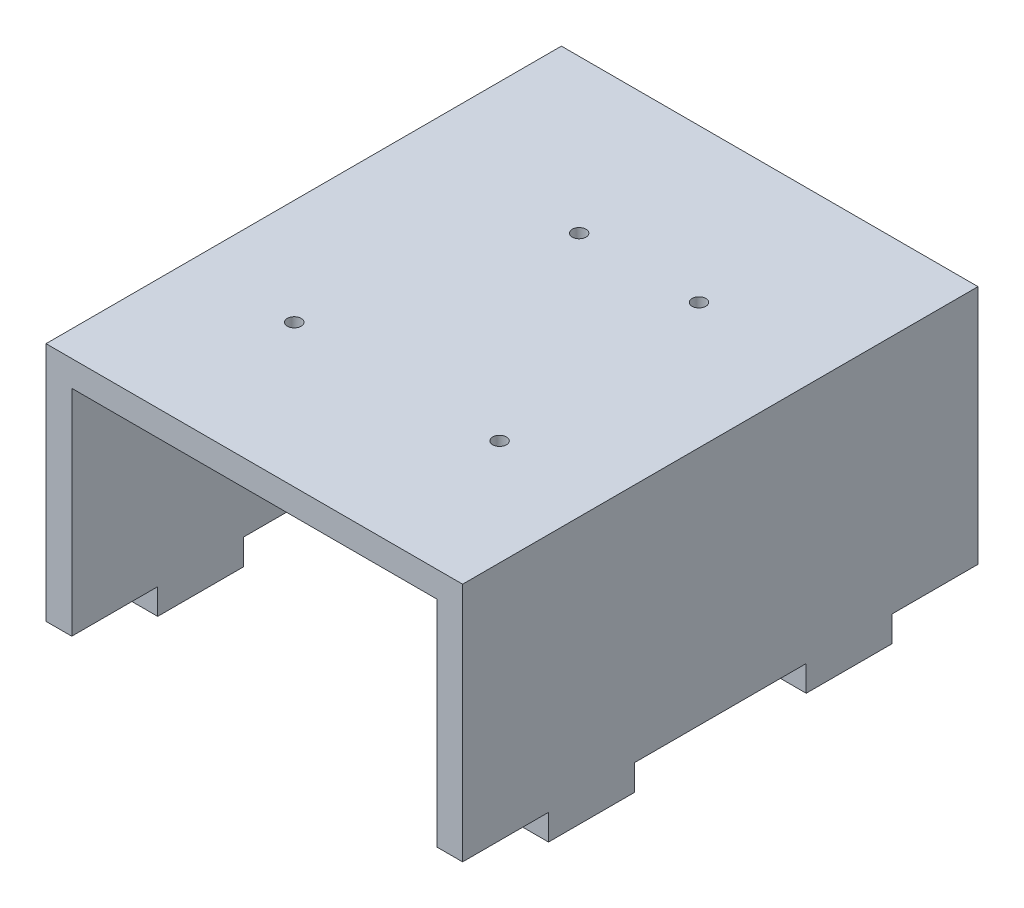
ISO-10303-21;
HEADER;
FILE_DESCRIPTION(('STEP AP214'),'2;1');
FILE_NAME('part.step','',(''),(''),'','','');
FILE_SCHEMA(('AUTOMOTIVE_DESIGN { 1 0 10303 214 1 1 1 1 }'));
ENDSEC;
DATA;
#1=APPLICATION_CONTEXT('core data for automotive mechanical design processes');
#2=APPLICATION_PROTOCOL_DEFINITION('international standard','automotive_design',2000,#1);
#3=PRODUCT_CONTEXT('',#1,'mechanical');
#4=PRODUCT('Part','Part','',(#3));
#5=PRODUCT_RELATED_PRODUCT_CATEGORY('part','',(#4));
#6=PRODUCT_DEFINITION_FORMATION('','',#4);
#7=PRODUCT_DEFINITION_CONTEXT('part definition',#1,'design');
#8=PRODUCT_DEFINITION('design','',#6,#7);
#9=PRODUCT_DEFINITION_SHAPE('','',#8);
#10=(LENGTH_UNIT() NAMED_UNIT(*) SI_UNIT(.MILLI.,.METRE.));
#11=(NAMED_UNIT(*) PLANE_ANGLE_UNIT() SI_UNIT($,.RADIAN.));
#12=(NAMED_UNIT(*) SI_UNIT($,.STERADIAN.) SOLID_ANGLE_UNIT());
#13=UNCERTAINTY_MEASURE_WITH_UNIT(LENGTH_MEASURE(1.E-05),#10,'distance_accuracy_value','');
#14=(GEOMETRIC_REPRESENTATION_CONTEXT(3) GLOBAL_UNCERTAINTY_ASSIGNED_CONTEXT((#13)) GLOBAL_UNIT_ASSIGNED_CONTEXT((#10,
#11,#12)) REPRESENTATION_CONTEXT('',''));
#15=CARTESIAN_POINT('',(0.,0.,0.));
#16=DIRECTION('',(0.,0.,1.));
#17=DIRECTION('',(1.,0.,0.));
#18=AXIS2_PLACEMENT_3D('',#15,#16,#17);
#19=CARTESIAN_POINT('',(-42.5,0.,120.));
#20=DIRECTION('',(0.,1.,0.));
#21=DIRECTION('',(-1.,0.,0.));
#22=AXIS2_PLACEMENT_3D('',#19,#20,#21);
#23=PLANE('',#22);
#24=DIRECTION('',(0.,0.,-1.));
#25=VECTOR('',#24,1.);
#26=CARTESIAN_POINT('',(-48.5,0.,120.));
#27=LINE('',#26,#25);
#28=CARTESIAN_POINT('',(-48.5,0.,120.));
#29=VERTEX_POINT('',#28);
#30=CARTESIAN_POINT('',(-48.5,0.,100.));
#31=VERTEX_POINT('',#30);
#32=EDGE_CURVE('E410',#29,#31,#27,.T.);
#33=ORIENTED_EDGE('',*,*,#32,.T.);
#34=DIRECTION('',(-1.,0.,0.));
#35=VECTOR('',#34,1.);
#36=CARTESIAN_POINT('',(-42.5,0.,100.));
#37=LINE('',#36,#35);
#38=CARTESIAN_POINT('',(-42.5,0.,100.));
#39=VERTEX_POINT('',#38);
#40=EDGE_CURVE('E65',#39,#31,#37,.T.);
#41=ORIENTED_EDGE('',*,*,#40,.F.);
#42=DIRECTION('',(0.,0.,-1.));
#43=VECTOR('',#42,1.);
#44=CARTESIAN_POINT('',(-42.5,0.,120.));
#45=LINE('',#44,#43);
#46=CARTESIAN_POINT('',(-42.5,0.,120.));
#47=VERTEX_POINT('',#46);
#48=EDGE_CURVE('E11',#47,#39,#45,.T.);
#49=ORIENTED_EDGE('',*,*,#48,.F.);
#50=DIRECTION('',(1.,0.,0.));
#51=VECTOR('',#50,1.);
#52=CARTESIAN_POINT('',(-42.5,0.,120.));
#53=LINE('',#52,#51);
#54=EDGE_CURVE('E357',#29,#47,#53,.T.);
#55=ORIENTED_EDGE('',*,*,#54,.F.);
#56=EDGE_LOOP('',(#33,#41,#49,#55));
#57=FACE_BOUND('',#56,.T.);
#58=ADVANCED_FACE('F41',(#57),#23,.F.);
#59=CARTESIAN_POINT('',(-42.5,0.,80.));
#60=VERTEX_POINT('',#59);
#61=CARTESIAN_POINT('',(-42.5,0.,40.));
#62=VERTEX_POINT('',#61);
#63=EDGE_CURVE('E50',#60,#62,#45,.T.);
#64=ORIENTED_EDGE('',*,*,#63,.F.);
#65=DIRECTION('',(-1.,0.,0.));
#66=VECTOR('',#65,1.);
#67=CARTESIAN_POINT('',(-42.5,0.,80.));
#68=LINE('',#67,#66);
#69=CARTESIAN_POINT('',(-48.5,0.,80.));
#70=VERTEX_POINT('',#69);
#71=EDGE_CURVE('E216',#60,#70,#68,.T.);
#72=ORIENTED_EDGE('',*,*,#71,.T.);
#73=CARTESIAN_POINT('',(-48.5,0.,40.));
#74=VERTEX_POINT('',#73);
#75=EDGE_CURVE('E414',#70,#74,#27,.T.);
#76=ORIENTED_EDGE('',*,*,#75,.T.);
#77=DIRECTION('',(-1.,0.,0.));
#78=VECTOR('',#77,1.);
#79=CARTESIAN_POINT('',(-42.5,0.,40.));
#80=LINE('',#79,#78);
#81=EDGE_CURVE('E273',#62,#74,#80,.T.);
#82=ORIENTED_EDGE('',*,*,#81,.F.);
#83=EDGE_LOOP('',(#64,#72,#76,#82));
#84=FACE_BOUND('',#83,.T.);
#85=ADVANCED_FACE('F450',(#84),#23,.F.);
#86=CARTESIAN_POINT('',(48.5,0.,120.));
#87=DIRECTION('',(0.,1.,0.));
#88=DIRECTION('',(-1.,0.,0.));
#89=AXIS2_PLACEMENT_3D('',#86,#87,#88);
#90=PLANE('',#89);
#91=DIRECTION('',(1.,0.,0.));
#92=VECTOR('',#91,1.);
#93=CARTESIAN_POINT('',(42.5,0.,40.));
#94=LINE('',#93,#92);
#95=CARTESIAN_POINT('',(42.5,0.,40.));
#96=VERTEX_POINT('',#95);
#97=CARTESIAN_POINT('',(48.5,0.,40.));
#98=VERTEX_POINT('',#97);
#99=EDGE_CURVE('E305',#96,#98,#94,.T.);
#100=ORIENTED_EDGE('',*,*,#99,.T.);
#101=DIRECTION('',(0.,0.,-1.));
#102=VECTOR('',#101,1.);
#103=CARTESIAN_POINT('',(48.5,0.,120.));
#104=LINE('',#103,#102);
#105=CARTESIAN_POINT('',(48.5,0.,80.));
#106=VERTEX_POINT('',#105);
#107=EDGE_CURVE('E428',#106,#98,#104,.T.);
#108=ORIENTED_EDGE('',*,*,#107,.F.);
#109=DIRECTION('',(1.,0.,0.));
#110=VECTOR('',#109,1.);
#111=CARTESIAN_POINT('',(42.5,0.,80.));
#112=LINE('',#111,#110);
#113=CARTESIAN_POINT('',(42.5,0.,80.));
#114=VERTEX_POINT('',#113);
#115=EDGE_CURVE('E351',#114,#106,#112,.T.);
#116=ORIENTED_EDGE('',*,*,#115,.F.);
#117=DIRECTION('',(0.,0.,-1.));
#118=VECTOR('',#117,1.);
#119=CARTESIAN_POINT('',(42.5,0.,120.));
#120=LINE('',#119,#118);
#121=EDGE_CURVE('E434',#114,#96,#120,.T.);
#122=ORIENTED_EDGE('',*,*,#121,.T.);
#123=EDGE_LOOP('',(#100,#108,#116,#122));
#124=FACE_BOUND('',#123,.T.);
#125=ADVANCED_FACE('F545',(#124),#90,.F.);
#126=DIRECTION('',(1.,0.,0.));
#127=VECTOR('',#126,1.);
#128=CARTESIAN_POINT('',(42.5,0.,20.));
#129=LINE('',#128,#127);
#130=CARTESIAN_POINT('',(42.5,0.,20.));
#131=VERTEX_POINT('',#130);
#132=CARTESIAN_POINT('',(48.5,0.,20.));
#133=VERTEX_POINT('',#132);
#134=EDGE_CURVE('E310',#131,#133,#129,.T.);
#135=ORIENTED_EDGE('',*,*,#134,.F.);
#136=CARTESIAN_POINT('',(42.5,0.,0.));
#137=VERTEX_POINT('',#136);
#138=EDGE_CURVE('E427',#131,#137,#120,.T.);
#139=ORIENTED_EDGE('',*,*,#138,.T.);
#140=DIRECTION('',(1.,0.,0.));
#141=VECTOR('',#140,1.);
#142=CARTESIAN_POINT('',(48.5,0.,0.));
#143=LINE('',#142,#141);
#144=CARTESIAN_POINT('',(48.5,0.,0.));
#145=VERTEX_POINT('',#144);
#146=EDGE_CURVE('E397',#137,#145,#143,.T.);
#147=ORIENTED_EDGE('',*,*,#146,.T.);
#148=EDGE_CURVE('E422',#133,#145,#104,.T.);
#149=ORIENTED_EDGE('',*,*,#148,.F.);
#150=EDGE_LOOP('',(#135,#139,#147,#149));
#151=FACE_BOUND('',#150,.T.);
#152=ADVANCED_FACE('F578',(#151),#90,.F.);
#153=CARTESIAN_POINT('',(42.5,0.,120.));
#154=VERTEX_POINT('',#153);
#155=CARTESIAN_POINT('',(42.5,0.,100.));
#156=VERTEX_POINT('',#155);
#157=EDGE_CURVE('E429',#154,#156,#120,.T.);
#158=ORIENTED_EDGE('',*,*,#157,.T.);
#159=DIRECTION('',(1.,0.,0.));
#160=VECTOR('',#159,1.);
#161=CARTESIAN_POINT('',(42.5,0.,100.));
#162=LINE('',#161,#160);
#163=CARTESIAN_POINT('',(48.5,0.,100.));
#164=VERTEX_POINT('',#163);
#165=EDGE_CURVE('E347',#156,#164,#162,.T.);
#166=ORIENTED_EDGE('',*,*,#165,.T.);
#167=CARTESIAN_POINT('',(48.5,0.,120.));
#168=VERTEX_POINT('',#167);
#169=EDGE_CURVE('E423',#168,#164,#104,.T.);
#170=ORIENTED_EDGE('',*,*,#169,.F.);
#171=DIRECTION('',(1.,0.,0.));
#172=VECTOR('',#171,1.);
#173=CARTESIAN_POINT('',(48.5,0.,120.));
#174=LINE('',#173,#172);
#175=EDGE_CURVE('E371',#154,#168,#174,.T.);
#176=ORIENTED_EDGE('',*,*,#175,.F.);
#177=EDGE_LOOP('',(#158,#166,#170,#176));
#178=FACE_BOUND('',#177,.T.);
#179=ADVANCED_FACE('F571',(#178),#90,.F.);
#180=CARTESIAN_POINT('',(-42.5,0.,20.));
#181=VERTEX_POINT('',#180);
#182=CARTESIAN_POINT('',(-42.5,0.,0.));
#183=VERTEX_POINT('',#182);
#184=EDGE_CURVE('E51',#181,#183,#45,.T.);
#185=ORIENTED_EDGE('',*,*,#184,.F.);
#186=DIRECTION('',(-1.,0.,0.));
#187=VECTOR('',#186,1.);
#188=CARTESIAN_POINT('',(-42.5,0.,20.));
#189=LINE('',#188,#187);
#190=CARTESIAN_POINT('',(-48.5,0.,20.));
#191=VERTEX_POINT('',#190);
#192=EDGE_CURVE('E262',#181,#191,#189,.T.);
#193=ORIENTED_EDGE('',*,*,#192,.T.);
#194=CARTESIAN_POINT('',(-48.5,0.,0.));
#195=VERTEX_POINT('',#194);
#196=EDGE_CURVE('E383',#191,#195,#27,.T.);
#197=ORIENTED_EDGE('',*,*,#196,.T.);
#198=DIRECTION('',(1.,0.,0.));
#199=VECTOR('',#198,1.);
#200=CARTESIAN_POINT('',(-42.5,0.,0.));
#201=LINE('',#200,#199);
#202=EDGE_CURVE('E346',#195,#183,#201,.T.);
#203=ORIENTED_EDGE('',*,*,#202,.T.);
#204=EDGE_LOOP('',(#185,#193,#197,#203));
#205=FACE_BOUND('',#204,.T.);
#206=ADVANCED_FACE('F43',(#205),#23,.F.);
#207=CARTESIAN_POINT('',(-42.5,50.,120.));
#208=DIRECTION('',(-1.,0.,0.));
#209=DIRECTION('',(0.,-1.,0.));
#210=AXIS2_PLACEMENT_3D('',#207,#208,#209);
#211=PLANE('',#210);
#212=DIRECTION('',(0.,1.,0.));
#213=VECTOR('',#212,1.);
#214=CARTESIAN_POINT('',(-42.5,50.,0.));
#215=LINE('',#214,#213);
#216=CARTESIAN_POINT('',(-42.5,50.,0.));
#217=VERTEX_POINT('',#216);
#218=EDGE_CURVE('E387',#183,#217,#215,.T.);
#219=ORIENTED_EDGE('',*,*,#218,.T.);
#220=DIRECTION('',(0.,0.,-1.));
#221=VECTOR('',#220,1.);
#222=CARTESIAN_POINT('',(-42.5,50.,120.));
#223=LINE('',#222,#221);
#224=CARTESIAN_POINT('',(-42.5,50.,120.));
#225=VERTEX_POINT('',#224);
#226=EDGE_CURVE('E437',#225,#217,#223,.T.);
#227=ORIENTED_EDGE('',*,*,#226,.F.);
#228=DIRECTION('',(0.,1.,0.));
#229=VECTOR('',#228,1.);
#230=CARTESIAN_POINT('',(-42.5,50.,120.));
#231=LINE('',#230,#229);
#232=EDGE_CURVE('E361',#47,#225,#231,.T.);
#233=ORIENTED_EDGE('',*,*,#232,.F.);
#234=ORIENTED_EDGE('',*,*,#48,.T.);
#235=DIRECTION('',(0.,1.,0.));
#236=VECTOR('',#235,1.);
#237=CARTESIAN_POINT('',(-42.5,0.,100.));
#238=LINE('',#237,#236);
#239=CARTESIAN_POINT('',(-42.5,-6.,100.));
#240=VERTEX_POINT('',#239);
#241=EDGE_CURVE('E223',#240,#39,#238,.T.);
#242=ORIENTED_EDGE('',*,*,#241,.F.);
#243=DIRECTION('',(0.,0.,1.));
#244=VECTOR('',#243,1.);
#245=CARTESIAN_POINT('',(-42.5,-6.,100.));
#246=LINE('',#245,#244);
#247=CARTESIAN_POINT('',(-42.5,-6.,80.));
#248=VERTEX_POINT('',#247);
#249=EDGE_CURVE('E208',#248,#240,#246,.T.);
#250=ORIENTED_EDGE('',*,*,#249,.F.);
#251=DIRECTION('',(0.,-1.,0.));
#252=VECTOR('',#251,1.);
#253=CARTESIAN_POINT('',(-42.5,-6.,80.));
#254=LINE('',#253,#252);
#255=EDGE_CURVE('E219',#60,#248,#254,.T.);
#256=ORIENTED_EDGE('',*,*,#255,.F.);
#257=ORIENTED_EDGE('',*,*,#63,.T.);
#258=DIRECTION('',(0.,1.,0.));
#259=VECTOR('',#258,1.);
#260=CARTESIAN_POINT('',(-42.5,-6.,40.));
#261=LINE('',#260,#259);
#262=CARTESIAN_POINT('',(-42.5,-6.,40.));
#263=VERTEX_POINT('',#262);
#264=EDGE_CURVE('E258',#263,#62,#261,.T.);
#265=ORIENTED_EDGE('',*,*,#264,.F.);
#266=DIRECTION('',(0.,0.,1.));
#267=VECTOR('',#266,1.);
#268=CARTESIAN_POINT('',(-42.5,-6.,20.));
#269=LINE('',#268,#267);
#270=CARTESIAN_POINT('',(-42.5,-6.,20.));
#271=VERTEX_POINT('',#270);
#272=EDGE_CURVE('E253',#271,#263,#269,.T.);
#273=ORIENTED_EDGE('',*,*,#272,.F.);
#274=DIRECTION('',(0.,-1.,0.));
#275=VECTOR('',#274,1.);
#276=CARTESIAN_POINT('',(-42.5,0.,20.));
#277=LINE('',#276,#275);
#278=EDGE_CURVE('E249',#181,#271,#277,.T.);
#279=ORIENTED_EDGE('',*,*,#278,.F.);
#280=ORIENTED_EDGE('',*,*,#184,.T.);
#281=EDGE_LOOP('',(#219,#227,#233,#234,#242,#250,#256,#257,#265,#273,#279,#280));
#282=FACE_BOUND('',#281,.T.);
#283=ADVANCED_FACE('F226',(#282),#211,.F.);
#284=CARTESIAN_POINT('',(42.5,50.,120.));
#285=DIRECTION('',(0.,1.,0.));
#286=DIRECTION('',(-1.,0.,0.));
#287=AXIS2_PLACEMENT_3D('',#284,#285,#286);
#288=PLANE('',#287);
#289=CARTESIAN_POINT('',(-23.905,50.,86.7984221499256));
#290=DIRECTION('',(0.,1.,0.));
#291=DIRECTION('',(-1.,0.,0.));
#292=AXIS2_PLACEMENT_3D('',#289,#290,#291);
#293=CIRCLE('',#292,1.60000000000001);
#294=CARTESIAN_POINT('',(-25.505,50.,86.7984221499256));
#295=VERTEX_POINT('',#294);
#296=EDGE_CURVE('E239',#295,#295,#293,.T.);
#297=ORIENTED_EDGE('',*,*,#296,.T.);
#298=EDGE_LOOP('',(#297));
#299=FACE_BOUND('',#298,.T.);
#300=CARTESIAN_POINT('',(19.19,50.,35.6584221499256));
#301=DIRECTION('',(0.,1.,0.));
#302=DIRECTION('',(-1.,0.,0.));
#303=AXIS2_PLACEMENT_3D('',#300,#301,#302);
#304=CIRCLE('',#303,1.6);
#305=CARTESIAN_POINT('',(17.59,50.,35.6584221499256));
#306=VERTEX_POINT('',#305);
#307=EDGE_CURVE('E485',#306,#306,#304,.T.);
#308=ORIENTED_EDGE('',*,*,#307,.T.);
#309=EDGE_LOOP('',(#308));
#310=FACE_BOUND('',#309,.T.);
#311=CARTESIAN_POINT('',(-8.71000000000002,50.,35.6584221499256));
#312=DIRECTION('',(0.,1.,0.));
#313=DIRECTION('',(-1.,0.,0.));
#314=AXIS2_PLACEMENT_3D('',#311,#312,#313);
#315=CIRCLE('',#314,1.6);
#316=CARTESIAN_POINT('',(-10.31,50.,35.6584221499256));
#317=VERTEX_POINT('',#316);
#318=EDGE_CURVE('E489',#317,#317,#315,.T.);
#319=ORIENTED_EDGE('',*,*,#318,.T.);
#320=EDGE_LOOP('',(#319));
#321=FACE_BOUND('',#320,.T.);
#322=CARTESIAN_POINT('',(23.905,50.,86.7984221499256));
#323=DIRECTION('',(0.,1.,0.));
#324=DIRECTION('',(-1.,0.,0.));
#325=AXIS2_PLACEMENT_3D('',#322,#323,#324);
#326=CIRCLE('',#325,1.60000000000001);
#327=CARTESIAN_POINT('',(22.305,50.,86.7984221499256));
#328=VERTEX_POINT('',#327);
#329=EDGE_CURVE('E493',#328,#328,#326,.T.);
#330=ORIENTED_EDGE('',*,*,#329,.T.);
#331=EDGE_LOOP('',(#330));
#332=FACE_BOUND('',#331,.T.);
#333=DIRECTION('',(1.,0.,0.));
#334=VECTOR('',#333,1.);
#335=CARTESIAN_POINT('',(42.5,50.,0.));
#336=LINE('',#335,#334);
#337=CARTESIAN_POINT('',(42.5,50.,0.));
#338=VERTEX_POINT('',#337);
#339=EDGE_CURVE('E390',#217,#338,#336,.T.);
#340=ORIENTED_EDGE('',*,*,#339,.T.);
#341=DIRECTION('',(0.,0.,-1.));
#342=VECTOR('',#341,1.);
#343=CARTESIAN_POINT('',(42.5,50.,120.));
#344=LINE('',#343,#342);
#345=CARTESIAN_POINT('',(42.5,50.,120.));
#346=VERTEX_POINT('',#345);
#347=EDGE_CURVE('E433',#346,#338,#344,.T.);
#348=ORIENTED_EDGE('',*,*,#347,.F.);
#349=DIRECTION('',(1.,0.,0.));
#350=VECTOR('',#349,1.);
#351=CARTESIAN_POINT('',(42.5,50.,120.));
#352=LINE('',#351,#350);
#353=EDGE_CURVE('E365',#225,#346,#352,.T.);
#354=ORIENTED_EDGE('',*,*,#353,.F.);
#355=ORIENTED_EDGE('',*,*,#226,.T.);
#356=EDGE_LOOP('',(#340,#348,#354,#355));
#357=FACE_BOUND('',#356,.T.);
#358=ADVANCED_FACE('F469',(#299,#310,#321,#332,#357),#288,.F.);
#359=CARTESIAN_POINT('',(42.5,0.,120.));
#360=DIRECTION('',(1.,0.,0.));
#361=DIRECTION('',(0.,0.,-1.));
#362=AXIS2_PLACEMENT_3D('',#359,#360,#361);
#363=PLANE('',#362);
#364=DIRECTION('',(0.,-1.,0.));
#365=VECTOR('',#364,1.);
#366=CARTESIAN_POINT('',(42.5,0.,0.));
#367=LINE('',#366,#365);
#368=EDGE_CURVE('E393',#338,#137,#367,.T.);
#369=ORIENTED_EDGE('',*,*,#368,.T.);
#370=ORIENTED_EDGE('',*,*,#138,.F.);
#371=DIRECTION('',(0.,-1.,0.));
#372=VECTOR('',#371,1.);
#373=CARTESIAN_POINT('',(42.5,0.,20.));
#374=LINE('',#373,#372);
#375=CARTESIAN_POINT('',(42.5,-5.99999999999999,20.));
#376=VERTEX_POINT('',#375);
#377=EDGE_CURVE('E294',#131,#376,#374,.T.);
#378=ORIENTED_EDGE('',*,*,#377,.T.);
#379=DIRECTION('',(0.,0.,1.));
#380=VECTOR('',#379,1.);
#381=CARTESIAN_POINT('',(42.5,-5.99999999999998,0.));
#382=LINE('',#381,#380);
#383=CARTESIAN_POINT('',(42.5,-5.99999999999999,40.));
#384=VERTEX_POINT('',#383);
#385=EDGE_CURVE('E290',#376,#384,#382,.T.);
#386=ORIENTED_EDGE('',*,*,#385,.T.);
#387=DIRECTION('',(0.,1.,0.));
#388=VECTOR('',#387,1.);
#389=CARTESIAN_POINT('',(42.5,0.,40.));
#390=LINE('',#389,#388);
#391=EDGE_CURVE('E287',#384,#96,#390,.T.);
#392=ORIENTED_EDGE('',*,*,#391,.T.);
#393=ORIENTED_EDGE('',*,*,#121,.F.);
#394=DIRECTION('',(0.,1.,0.));
#395=VECTOR('',#394,1.);
#396=CARTESIAN_POINT('',(42.5,0.,80.));
#397=LINE('',#396,#395);
#398=CARTESIAN_POINT('',(42.5,-5.99999999999999,80.));
#399=VERTEX_POINT('',#398);
#400=EDGE_CURVE('E325',#399,#114,#397,.T.);
#401=ORIENTED_EDGE('',*,*,#400,.F.);
#402=DIRECTION('',(0.,0.,-1.));
#403=VECTOR('',#402,1.);
#404=CARTESIAN_POINT('',(42.5,-6.,0.));
#405=LINE('',#404,#403);
#406=CARTESIAN_POINT('',(42.5,-5.99999999999999,100.));
#407=VERTEX_POINT('',#406);
#408=EDGE_CURVE('E321',#407,#399,#405,.T.);
#409=ORIENTED_EDGE('',*,*,#408,.F.);
#410=DIRECTION('',(0.,-1.,0.));
#411=VECTOR('',#410,1.);
#412=CARTESIAN_POINT('',(42.5,0.,100.));
#413=LINE('',#412,#411);
#414=EDGE_CURVE('E329',#156,#407,#413,.T.);
#415=ORIENTED_EDGE('',*,*,#414,.F.);
#416=ORIENTED_EDGE('',*,*,#157,.F.);
#417=DIRECTION('',(0.,-1.,0.));
#418=VECTOR('',#417,1.);
#419=CARTESIAN_POINT('',(42.5,0.,120.));
#420=LINE('',#419,#418);
#421=EDGE_CURVE('E368',#346,#154,#420,.T.);
#422=ORIENTED_EDGE('',*,*,#421,.F.);
#423=ORIENTED_EDGE('',*,*,#347,.T.);
#424=EDGE_LOOP('',(#369,#370,#378,#386,#392,#393,#401,#409,#415,#416,#422,#423));
#425=FACE_BOUND('',#424,.T.);
#426=ADVANCED_FACE('F550',(#425),#363,.F.);
#427=CARTESIAN_POINT('',(48.5,56.,120.));
#428=DIRECTION('',(-1.,0.,0.));
#429=DIRECTION('',(0.,-1.,0.));
#430=AXIS2_PLACEMENT_3D('',#427,#428,#429);
#431=PLANE('',#430);
#432=DIRECTION('',(0.,1.,0.));
#433=VECTOR('',#432,1.);
#434=CARTESIAN_POINT('',(48.5,56.,0.));
#435=LINE('',#434,#433);
#436=CARTESIAN_POINT('',(48.5,56.,0.));
#437=VERTEX_POINT('',#436);
#438=EDGE_CURVE('E401',#145,#437,#435,.T.);
#439=ORIENTED_EDGE('',*,*,#438,.T.);
#440=DIRECTION('',(0.,0.,-1.));
#441=VECTOR('',#440,1.);
#442=CARTESIAN_POINT('',(48.5,56.,120.));
#443=LINE('',#442,#441);
#444=CARTESIAN_POINT('',(48.5,56.,120.));
#445=VERTEX_POINT('',#444);
#446=EDGE_CURVE('E418',#445,#437,#443,.T.);
#447=ORIENTED_EDGE('',*,*,#446,.F.);
#448=DIRECTION('',(0.,1.,0.));
#449=VECTOR('',#448,1.);
#450=CARTESIAN_POINT('',(48.5,56.,120.));
#451=LINE('',#450,#449);
#452=EDGE_CURVE('E374',#168,#445,#451,.T.);
#453=ORIENTED_EDGE('',*,*,#452,.F.);
#454=ORIENTED_EDGE('',*,*,#169,.T.);
#455=DIRECTION('',(0.,-1.,0.));
#456=VECTOR('',#455,1.);
#457=CARTESIAN_POINT('',(48.5,0.,100.));
#458=LINE('',#457,#456);
#459=CARTESIAN_POINT('',(48.5,-5.99999999999999,100.));
#460=VERTEX_POINT('',#459);
#461=EDGE_CURVE('E326',#164,#460,#458,.T.);
#462=ORIENTED_EDGE('',*,*,#461,.T.);
#463=DIRECTION('',(0.,0.,-1.));
#464=VECTOR('',#463,1.);
#465=CARTESIAN_POINT('',(48.5,-6.,0.));
#466=LINE('',#465,#464);
#467=CARTESIAN_POINT('',(48.5,-5.99999999999999,80.));
#468=VERTEX_POINT('',#467);
#469=EDGE_CURVE('E309',#460,#468,#466,.T.);
#470=ORIENTED_EDGE('',*,*,#469,.T.);
#471=DIRECTION('',(0.,1.,0.));
#472=VECTOR('',#471,1.);
#473=CARTESIAN_POINT('',(48.5,0.,80.));
#474=LINE('',#473,#472);
#475=EDGE_CURVE('E337',#468,#106,#474,.T.);
#476=ORIENTED_EDGE('',*,*,#475,.T.);
#477=ORIENTED_EDGE('',*,*,#107,.T.);
#478=DIRECTION('',(0.,1.,0.));
#479=VECTOR('',#478,1.);
#480=CARTESIAN_POINT('',(48.5,0.,40.));
#481=LINE('',#480,#479);
#482=CARTESIAN_POINT('',(48.5,-5.99999999999999,40.));
#483=VERTEX_POINT('',#482);
#484=EDGE_CURVE('E277',#483,#98,#481,.T.);
#485=ORIENTED_EDGE('',*,*,#484,.F.);
#486=DIRECTION('',(0.,0.,1.));
#487=VECTOR('',#486,1.);
#488=CARTESIAN_POINT('',(48.5,-5.99999999999998,0.));
#489=LINE('',#488,#487);
#490=CARTESIAN_POINT('',(48.5,-5.99999999999999,20.));
#491=VERTEX_POINT('',#490);
#492=EDGE_CURVE('E300',#491,#483,#489,.T.);
#493=ORIENTED_EDGE('',*,*,#492,.F.);
#494=DIRECTION('',(0.,-1.,0.));
#495=VECTOR('',#494,1.);
#496=CARTESIAN_POINT('',(48.5,0.,20.));
#497=LINE('',#496,#495);
#498=EDGE_CURVE('E291',#133,#491,#497,.T.);
#499=ORIENTED_EDGE('',*,*,#498,.F.);
#500=ORIENTED_EDGE('',*,*,#148,.T.);
#501=EDGE_LOOP('',(#439,#447,#453,#454,#462,#470,#476,#477,#485,#493,#499,#500));
#502=FACE_BOUND('',#501,.T.);
#503=ADVANCED_FACE('F521',(#502),#431,.F.);
#504=CARTESIAN_POINT('',(-48.5,56.,120.));
#505=DIRECTION('',(0.,-1.,0.));
#506=DIRECTION('',(0.,0.,-1.));
#507=AXIS2_PLACEMENT_3D('',#504,#505,#506);
#508=PLANE('',#507);
#509=CARTESIAN_POINT('',(-23.905,56.,86.7984221499256));
#510=DIRECTION('',(0.,1.,0.));
#511=DIRECTION('',(0.,0.,1.));
#512=AXIS2_PLACEMENT_3D('',#509,#510,#511);
#513=CIRCLE('',#512,1.60000000000001);
#514=CARTESIAN_POINT('',(-23.905,56.,88.3984221499256));
#515=VERTEX_POINT('',#514);
#516=EDGE_CURVE('E497',#515,#515,#513,.T.);
#517=ORIENTED_EDGE('',*,*,#516,.F.);
#518=EDGE_LOOP('',(#517));
#519=FACE_BOUND('',#518,.T.);
#520=CARTESIAN_POINT('',(19.19,56.,35.6584221499256));
#521=DIRECTION('',(0.,1.,0.));
#522=DIRECTION('',(0.,0.,1.));
#523=AXIS2_PLACEMENT_3D('',#520,#521,#522);
#524=CIRCLE('',#523,1.6);
#525=CARTESIAN_POINT('',(19.19,56.,37.2584221499256));
#526=VERTEX_POINT('',#525);
#527=EDGE_CURVE('E503',#526,#526,#524,.T.);
#528=ORIENTED_EDGE('',*,*,#527,.F.);
#529=EDGE_LOOP('',(#528));
#530=FACE_BOUND('',#529,.T.);
#531=CARTESIAN_POINT('',(-8.71000000000002,56.,35.6584221499256));
#532=DIRECTION('',(0.,1.,0.));
#533=DIRECTION('',(0.,0.,1.));
#534=AXIS2_PLACEMENT_3D('',#531,#532,#533);
#535=CIRCLE('',#534,1.6);
#536=CARTESIAN_POINT('',(-8.71000000000002,56.,37.2584221499256));
#537=VERTEX_POINT('',#536);
#538=EDGE_CURVE('E498',#537,#537,#535,.T.);
#539=ORIENTED_EDGE('',*,*,#538,.F.);
#540=EDGE_LOOP('',(#539));
#541=FACE_BOUND('',#540,.T.);
#542=CARTESIAN_POINT('',(23.905,56.,86.7984221499256));
#543=DIRECTION('',(0.,1.,0.));
#544=DIRECTION('',(0.,0.,1.));
#545=AXIS2_PLACEMENT_3D('',#542,#543,#544);
#546=CIRCLE('',#545,1.60000000000001);
#547=CARTESIAN_POINT('',(23.905,56.,88.3984221499256));
#548=VERTEX_POINT('',#547);
#549=EDGE_CURVE('E502',#548,#548,#546,.T.);
#550=ORIENTED_EDGE('',*,*,#549,.F.);
#551=EDGE_LOOP('',(#550));
#552=FACE_BOUND('',#551,.T.);
#553=DIRECTION('',(-1.,0.,0.));
#554=VECTOR('',#553,1.);
#555=CARTESIAN_POINT('',(-48.5,56.,0.));
#556=LINE('',#555,#554);
#557=CARTESIAN_POINT('',(-48.5,56.,0.));
#558=VERTEX_POINT('',#557);
#559=EDGE_CURVE('E404',#437,#558,#556,.T.);
#560=ORIENTED_EDGE('',*,*,#559,.T.);
#561=DIRECTION('',(0.,0.,-1.));
#562=VECTOR('',#561,1.);
#563=CARTESIAN_POINT('',(-48.5,56.,120.));
#564=LINE('',#563,#562);
#565=CARTESIAN_POINT('',(-48.5,56.,120.));
#566=VERTEX_POINT('',#565);
#567=EDGE_CURVE('E413',#566,#558,#564,.T.);
#568=ORIENTED_EDGE('',*,*,#567,.F.);
#569=DIRECTION('',(-1.,0.,0.));
#570=VECTOR('',#569,1.);
#571=CARTESIAN_POINT('',(-48.5,56.,120.));
#572=LINE('',#571,#570);
#573=EDGE_CURVE('E377',#445,#566,#572,.T.);
#574=ORIENTED_EDGE('',*,*,#573,.F.);
#575=ORIENTED_EDGE('',*,*,#446,.T.);
#576=EDGE_LOOP('',(#560,#568,#574,#575));
#577=FACE_BOUND('',#576,.T.);
#578=ADVANCED_FACE('F517',(#519,#530,#541,#552,#577),#508,.F.);
#579=CARTESIAN_POINT('',(-48.5,0.,120.));
#580=DIRECTION('',(1.,0.,0.));
#581=DIRECTION('',(0.,0.,-1.));
#582=AXIS2_PLACEMENT_3D('',#579,#580,#581);
#583=PLANE('',#582);
#584=DIRECTION('',(0.,-1.,0.));
#585=VECTOR('',#584,1.);
#586=CARTESIAN_POINT('',(-48.5,0.,0.));
#587=LINE('',#586,#585);
#588=EDGE_CURVE('E362',#558,#195,#587,.T.);
#589=ORIENTED_EDGE('',*,*,#588,.T.);
#590=ORIENTED_EDGE('',*,*,#196,.F.);
#591=DIRECTION('',(0.,-1.,0.));
#592=VECTOR('',#591,1.);
#593=CARTESIAN_POINT('',(-48.5,0.,20.));
#594=LINE('',#593,#592);
#595=CARTESIAN_POINT('',(-48.5,-6.,20.));
#596=VERTEX_POINT('',#595);
#597=EDGE_CURVE('E245',#191,#596,#594,.T.);
#598=ORIENTED_EDGE('',*,*,#597,.T.);
#599=DIRECTION('',(0.,0.,1.));
#600=VECTOR('',#599,1.);
#601=CARTESIAN_POINT('',(-48.5,-6.,20.));
#602=LINE('',#601,#600);
#603=CARTESIAN_POINT('',(-48.5,-6.,40.));
#604=VERTEX_POINT('',#603);
#605=EDGE_CURVE('E266',#596,#604,#602,.T.);
#606=ORIENTED_EDGE('',*,*,#605,.T.);
#607=DIRECTION('',(0.,1.,0.));
#608=VECTOR('',#607,1.);
#609=CARTESIAN_POINT('',(-48.5,-6.,40.));
#610=LINE('',#609,#608);
#611=EDGE_CURVE('E254',#604,#74,#610,.T.);
#612=ORIENTED_EDGE('',*,*,#611,.T.);
#613=ORIENTED_EDGE('',*,*,#75,.F.);
#614=DIRECTION('',(0.,-1.,0.));
#615=VECTOR('',#614,1.);
#616=CARTESIAN_POINT('',(-48.5,-6.,80.));
#617=LINE('',#616,#615);
#618=CARTESIAN_POINT('',(-48.5,-6.,80.));
#619=VERTEX_POINT('',#618);
#620=EDGE_CURVE('E238',#70,#619,#617,.T.);
#621=ORIENTED_EDGE('',*,*,#620,.T.);
#622=DIRECTION('',(0.,0.,1.));
#623=VECTOR('',#622,1.);
#624=CARTESIAN_POINT('',(-48.5,-6.,100.));
#625=LINE('',#624,#623);
#626=CARTESIAN_POINT('',(-48.5,-6.,100.));
#627=VERTEX_POINT('',#626);
#628=EDGE_CURVE('E210',#619,#627,#625,.T.);
#629=ORIENTED_EDGE('',*,*,#628,.T.);
#630=DIRECTION('',(0.,1.,0.));
#631=VECTOR('',#630,1.);
#632=CARTESIAN_POINT('',(-48.5,0.,100.));
#633=LINE('',#632,#631);
#634=EDGE_CURVE('E234',#627,#31,#633,.T.);
#635=ORIENTED_EDGE('',*,*,#634,.T.);
#636=ORIENTED_EDGE('',*,*,#32,.F.);
#637=DIRECTION('',(0.,-1.,0.));
#638=VECTOR('',#637,1.);
#639=CARTESIAN_POINT('',(-48.5,0.,120.));
#640=LINE('',#639,#638);
#641=EDGE_CURVE('E380',#566,#29,#640,.T.);
#642=ORIENTED_EDGE('',*,*,#641,.F.);
#643=ORIENTED_EDGE('',*,*,#567,.T.);
#644=EDGE_LOOP('',(#589,#590,#598,#606,#612,#613,#621,#629,#635,#636,#642,#643));
#645=FACE_BOUND('',#644,.T.);
#646=ADVANCED_FACE('F520',(#645),#583,.F.);
#647=CARTESIAN_POINT('',(0.,0.,120.));
#648=DIRECTION('',(0.,0.,-1.));
#649=DIRECTION('',(-1.,0.,0.));
#650=AXIS2_PLACEMENT_3D('',#647,#648,#649);
#651=PLANE('',#650);
#652=ORIENTED_EDGE('',*,*,#54,.T.);
#653=ORIENTED_EDGE('',*,*,#232,.T.);
#654=ORIENTED_EDGE('',*,*,#353,.T.);
#655=ORIENTED_EDGE('',*,*,#421,.T.);
#656=ORIENTED_EDGE('',*,*,#175,.T.);
#657=ORIENTED_EDGE('',*,*,#452,.T.);
#658=ORIENTED_EDGE('',*,*,#573,.T.);
#659=ORIENTED_EDGE('',*,*,#641,.T.);
#660=EDGE_LOOP('',(#652,#653,#654,#655,#656,#657,#658,#659));
#661=FACE_BOUND('',#660,.T.);
#662=ADVANCED_FACE('F472',(#661),#651,.F.);
#663=CARTESIAN_POINT('',(0.,0.,0.));
#664=DIRECTION('',(0.,0.,-1.));
#665=DIRECTION('',(-1.,0.,0.));
#666=AXIS2_PLACEMENT_3D('',#663,#664,#665);
#667=PLANE('',#666);
#668=ORIENTED_EDGE('',*,*,#202,.F.);
#669=ORIENTED_EDGE('',*,*,#588,.F.);
#670=ORIENTED_EDGE('',*,*,#559,.F.);
#671=ORIENTED_EDGE('',*,*,#438,.F.);
#672=ORIENTED_EDGE('',*,*,#146,.F.);
#673=ORIENTED_EDGE('',*,*,#368,.F.);
#674=ORIENTED_EDGE('',*,*,#339,.F.);
#675=ORIENTED_EDGE('',*,*,#218,.F.);
#676=EDGE_LOOP('',(#668,#669,#670,#671,#672,#673,#674,#675));
#677=FACE_BOUND('',#676,.T.);
#678=ADVANCED_FACE('F465',(#677),#667,.T.);
#679=CARTESIAN_POINT('',(42.5,-6.,0.));
#680=DIRECTION('',(0.,-1.,0.));
#681=DIRECTION('',(0.,0.,-1.));
#682=AXIS2_PLACEMENT_3D('',#679,#680,#681);
#683=PLANE('',#682);
#684=ORIENTED_EDGE('',*,*,#469,.F.);
#685=DIRECTION('',(1.,0.,0.));
#686=VECTOR('',#685,1.);
#687=CARTESIAN_POINT('',(42.5,-5.99999999999999,100.));
#688=LINE('',#687,#686);
#689=EDGE_CURVE('E343',#407,#460,#688,.T.);
#690=ORIENTED_EDGE('',*,*,#689,.F.);
#691=ORIENTED_EDGE('',*,*,#408,.T.);
#692=DIRECTION('',(1.,0.,0.));
#693=VECTOR('',#692,1.);
#694=CARTESIAN_POINT('',(42.5,-5.99999999999999,80.));
#695=LINE('',#694,#693);
#696=EDGE_CURVE('E333',#399,#468,#695,.T.);
#697=ORIENTED_EDGE('',*,*,#696,.T.);
#698=EDGE_LOOP('',(#684,#690,#691,#697));
#699=FACE_BOUND('',#698,.T.);
#700=ADVANCED_FACE('F565',(#699),#683,.T.);
#701=CARTESIAN_POINT('',(42.5,0.,100.));
#702=DIRECTION('',(0.,0.,1.));
#703=DIRECTION('',(1.,0.,0.));
#704=AXIS2_PLACEMENT_3D('',#701,#702,#703);
#705=PLANE('',#704);
#706=ORIENTED_EDGE('',*,*,#461,.F.);
#707=ORIENTED_EDGE('',*,*,#165,.F.);
#708=ORIENTED_EDGE('',*,*,#414,.T.);
#709=ORIENTED_EDGE('',*,*,#689,.T.);
#710=EDGE_LOOP('',(#706,#707,#708,#709));
#711=FACE_BOUND('',#710,.T.);
#712=ADVANCED_FACE('F568',(#711),#705,.T.);
#713=CARTESIAN_POINT('',(42.5,0.,80.));
#714=DIRECTION('',(0.,0.,-1.));
#715=DIRECTION('',(-1.,0.,0.));
#716=AXIS2_PLACEMENT_3D('',#713,#714,#715);
#717=PLANE('',#716);
#718=ORIENTED_EDGE('',*,*,#475,.F.);
#719=ORIENTED_EDGE('',*,*,#696,.F.);
#720=ORIENTED_EDGE('',*,*,#400,.T.);
#721=ORIENTED_EDGE('',*,*,#115,.T.);
#722=EDGE_LOOP('',(#718,#719,#720,#721));
#723=FACE_BOUND('',#722,.T.);
#724=ADVANCED_FACE('F563',(#723),#717,.T.);
#725=CARTESIAN_POINT('',(42.5,0.,40.));
#726=DIRECTION('',(0.,0.,-1.));
#727=DIRECTION('',(-1.,0.,0.));
#728=AXIS2_PLACEMENT_3D('',#725,#726,#727);
#729=PLANE('',#728);
#730=ORIENTED_EDGE('',*,*,#484,.T.);
#731=ORIENTED_EDGE('',*,*,#99,.F.);
#732=ORIENTED_EDGE('',*,*,#391,.F.);
#733=DIRECTION('',(1.,0.,0.));
#734=VECTOR('',#733,1.);
#735=CARTESIAN_POINT('',(42.5,-5.99999999999999,40.));
#736=LINE('',#735,#734);
#737=EDGE_CURVE('E297',#384,#483,#736,.T.);
#738=ORIENTED_EDGE('',*,*,#737,.T.);
#739=EDGE_LOOP('',(#730,#731,#732,#738));
#740=FACE_BOUND('',#739,.T.);
#741=ADVANCED_FACE('F556',(#740),#729,.F.);
#742=CARTESIAN_POINT('',(42.5,0.,20.));
#743=DIRECTION('',(0.,0.,1.));
#744=DIRECTION('',(1.,0.,0.));
#745=AXIS2_PLACEMENT_3D('',#742,#743,#744);
#746=PLANE('',#745);
#747=ORIENTED_EDGE('',*,*,#498,.T.);
#748=DIRECTION('',(1.,0.,0.));
#749=VECTOR('',#748,1.);
#750=CARTESIAN_POINT('',(42.5,-5.99999999999999,20.));
#751=LINE('',#750,#749);
#752=EDGE_CURVE('E314',#376,#491,#751,.T.);
#753=ORIENTED_EDGE('',*,*,#752,.F.);
#754=ORIENTED_EDGE('',*,*,#377,.F.);
#755=ORIENTED_EDGE('',*,*,#134,.T.);
#756=EDGE_LOOP('',(#747,#753,#754,#755));
#757=FACE_BOUND('',#756,.T.);
#758=ADVANCED_FACE('F582',(#757),#746,.F.);
#759=CARTESIAN_POINT('',(42.5,-5.99999999999998,0.));
#760=DIRECTION('',(0.,1.,0.));
#761=DIRECTION('',(0.,0.,1.));
#762=AXIS2_PLACEMENT_3D('',#759,#760,#761);
#763=PLANE('',#762);
#764=ORIENTED_EDGE('',*,*,#492,.T.);
#765=ORIENTED_EDGE('',*,*,#737,.F.);
#766=ORIENTED_EDGE('',*,*,#385,.F.);
#767=ORIENTED_EDGE('',*,*,#752,.T.);
#768=EDGE_LOOP('',(#764,#765,#766,#767));
#769=FACE_BOUND('',#768,.T.);
#770=ADVANCED_FACE('F584',(#769),#763,.F.);
#771=CARTESIAN_POINT('',(-42.5,-6.,40.));
#772=DIRECTION('',(0.,0.,1.));
#773=DIRECTION('',(1.,0.,0.));
#774=AXIS2_PLACEMENT_3D('',#771,#772,#773);
#775=PLANE('',#774);
#776=ORIENTED_EDGE('',*,*,#611,.F.);
#777=DIRECTION('',(-1.,0.,0.));
#778=VECTOR('',#777,1.);
#779=CARTESIAN_POINT('',(-42.5,-6.,40.));
#780=LINE('',#779,#778);
#781=EDGE_CURVE('E278',#263,#604,#780,.T.);
#782=ORIENTED_EDGE('',*,*,#781,.F.);
#783=ORIENTED_EDGE('',*,*,#264,.T.);
#784=ORIENTED_EDGE('',*,*,#81,.T.);
#785=EDGE_LOOP('',(#776,#782,#783,#784));
#786=FACE_BOUND('',#785,.T.);
#787=ADVANCED_FACE('F453',(#786),#775,.T.);
#788=CARTESIAN_POINT('',(-42.5,-6.,20.));
#789=DIRECTION('',(0.,-1.,0.));
#790=DIRECTION('',(0.,0.,-1.));
#791=AXIS2_PLACEMENT_3D('',#788,#789,#790);
#792=PLANE('',#791);
#793=ORIENTED_EDGE('',*,*,#605,.F.);
#794=DIRECTION('',(-1.,0.,0.));
#795=VECTOR('',#794,1.);
#796=CARTESIAN_POINT('',(-42.5,-6.,20.));
#797=LINE('',#796,#795);
#798=EDGE_CURVE('E281',#271,#596,#797,.T.);
#799=ORIENTED_EDGE('',*,*,#798,.F.);
#800=ORIENTED_EDGE('',*,*,#272,.T.);
#801=ORIENTED_EDGE('',*,*,#781,.T.);
#802=EDGE_LOOP('',(#793,#799,#800,#801));
#803=FACE_BOUND('',#802,.T.);
#804=ADVANCED_FACE('F456',(#803),#792,.T.);
#805=CARTESIAN_POINT('',(-42.5,0.,20.));
#806=DIRECTION('',(0.,0.,-1.));
#807=DIRECTION('',(-1.,0.,0.));
#808=AXIS2_PLACEMENT_3D('',#805,#806,#807);
#809=PLANE('',#808);
#810=ORIENTED_EDGE('',*,*,#597,.F.);
#811=ORIENTED_EDGE('',*,*,#192,.F.);
#812=ORIENTED_EDGE('',*,*,#278,.T.);
#813=ORIENTED_EDGE('',*,*,#798,.T.);
#814=EDGE_LOOP('',(#810,#811,#812,#813));
#815=FACE_BOUND('',#814,.T.);
#816=ADVANCED_FACE('F460',(#815),#809,.T.);
#817=CARTESIAN_POINT('',(-42.5,0.,100.));
#818=DIRECTION('',(0.,0.,1.));
#819=DIRECTION('',(1.,0.,0.));
#820=AXIS2_PLACEMENT_3D('',#817,#818,#819);
#821=PLANE('',#820);
#822=ORIENTED_EDGE('',*,*,#634,.F.);
#823=DIRECTION('',(-1.,0.,0.));
#824=VECTOR('',#823,1.);
#825=CARTESIAN_POINT('',(-42.5,-6.,100.));
#826=LINE('',#825,#824);
#827=EDGE_CURVE('E215',#240,#627,#826,.T.);
#828=ORIENTED_EDGE('',*,*,#827,.F.);
#829=ORIENTED_EDGE('',*,*,#241,.T.);
#830=ORIENTED_EDGE('',*,*,#40,.T.);
#831=EDGE_LOOP('',(#822,#828,#829,#830));
#832=FACE_BOUND('',#831,.T.);
#833=ADVANCED_FACE('F479',(#832),#821,.T.);
#834=CARTESIAN_POINT('',(-42.5,-6.,100.));
#835=DIRECTION('',(0.,-1.,0.));
#836=DIRECTION('',(0.,0.,-1.));
#837=AXIS2_PLACEMENT_3D('',#834,#835,#836);
#838=PLANE('',#837);
#839=ORIENTED_EDGE('',*,*,#628,.F.);
#840=DIRECTION('',(-1.,0.,0.));
#841=VECTOR('',#840,1.);
#842=CARTESIAN_POINT('',(-42.5,-6.,80.));
#843=LINE('',#842,#841);
#844=EDGE_CURVE('E204',#248,#619,#843,.T.);
#845=ORIENTED_EDGE('',*,*,#844,.F.);
#846=ORIENTED_EDGE('',*,*,#249,.T.);
#847=ORIENTED_EDGE('',*,*,#827,.T.);
#848=EDGE_LOOP('',(#839,#845,#846,#847));
#849=FACE_BOUND('',#848,.T.);
#850=ADVANCED_FACE('F206',(#849),#838,.T.);
#851=CARTESIAN_POINT('',(-42.5,-6.,80.));
#852=DIRECTION('',(0.,0.,-1.));
#853=DIRECTION('',(-1.,0.,0.));
#854=AXIS2_PLACEMENT_3D('',#851,#852,#853);
#855=PLANE('',#854);
#856=ORIENTED_EDGE('',*,*,#620,.F.);
#857=ORIENTED_EDGE('',*,*,#71,.F.);
#858=ORIENTED_EDGE('',*,*,#255,.T.);
#859=ORIENTED_EDGE('',*,*,#844,.T.);
#860=EDGE_LOOP('',(#856,#857,#858,#859));
#861=FACE_BOUND('',#860,.T.);
#862=ADVANCED_FACE('F220',(#861),#855,.T.);
#863=CARTESIAN_POINT('',(23.905,46.,86.7984221499256));
#864=DIRECTION('',(0.,1.,0.));
#865=DIRECTION('',(0.,0.,1.));
#866=AXIS2_PLACEMENT_3D('',#863,#864,#865);
#867=CYLINDRICAL_SURFACE('',#866,1.60000000000001);
#868=ORIENTED_EDGE('',*,*,#549,.T.);
#869=EDGE_LOOP('',(#868));
#870=FACE_BOUND('',#869,.T.);
#871=ORIENTED_EDGE('',*,*,#329,.F.);
#872=EDGE_LOOP('',(#871));
#873=FACE_BOUND('',#872,.T.);
#874=ADVANCED_FACE('F760',(#870,#873),#867,.F.);
#875=CARTESIAN_POINT('',(-8.71000000000002,46.,35.6584221499256));
#876=DIRECTION('',(0.,1.,0.));
#877=DIRECTION('',(0.,0.,1.));
#878=AXIS2_PLACEMENT_3D('',#875,#876,#877);
#879=CYLINDRICAL_SURFACE('',#878,1.6);
#880=ORIENTED_EDGE('',*,*,#538,.T.);
#881=EDGE_LOOP('',(#880));
#882=FACE_BOUND('',#881,.T.);
#883=ORIENTED_EDGE('',*,*,#318,.F.);
#884=EDGE_LOOP('',(#883));
#885=FACE_BOUND('',#884,.T.);
#886=ADVANCED_FACE('F786',(#882,#885),#879,.F.);
#887=CARTESIAN_POINT('',(19.19,46.,35.6584221499256));
#888=DIRECTION('',(0.,1.,0.));
#889=DIRECTION('',(0.,0.,1.));
#890=AXIS2_PLACEMENT_3D('',#887,#888,#889);
#891=CYLINDRICAL_SURFACE('',#890,1.6);
#892=ORIENTED_EDGE('',*,*,#527,.T.);
#893=EDGE_LOOP('',(#892));
#894=FACE_BOUND('',#893,.T.);
#895=ORIENTED_EDGE('',*,*,#307,.F.);
#896=EDGE_LOOP('',(#895));
#897=FACE_BOUND('',#896,.T.);
#898=ADVANCED_FACE('F796',(#894,#897),#891,.F.);
#899=CARTESIAN_POINT('',(-23.905,46.,86.7984221499256));
#900=DIRECTION('',(0.,1.,0.));
#901=DIRECTION('',(0.,0.,1.));
#902=AXIS2_PLACEMENT_3D('',#899,#900,#901);
#903=CYLINDRICAL_SURFACE('',#902,1.60000000000001);
#904=ORIENTED_EDGE('',*,*,#516,.T.);
#905=EDGE_LOOP('',(#904));
#906=FACE_BOUND('',#905,.T.);
#907=ORIENTED_EDGE('',*,*,#296,.F.);
#908=EDGE_LOOP('',(#907));
#909=FACE_BOUND('',#908,.T.);
#910=ADVANCED_FACE('F514',(#906,#909),#903,.F.);
#911=CLOSED_SHELL('',(#58,#85,#125,#152,#179,#206,#283,#358,#426,#503,#578,#646,#662,#678,#700,
#712,#724,#741,#758,#770,#787,#804,#816,#833,#850,#862,#874,#886,#898,#910));
#912=MANIFOLD_SOLID_BREP('B2',#911);
#913=ADVANCED_BREP_SHAPE_REPRESENTATION('',(#18,#912),#14);
#914=SHAPE_DEFINITION_REPRESENTATION(#9,#913);
ENDSEC;
END-ISO-10303-21;
